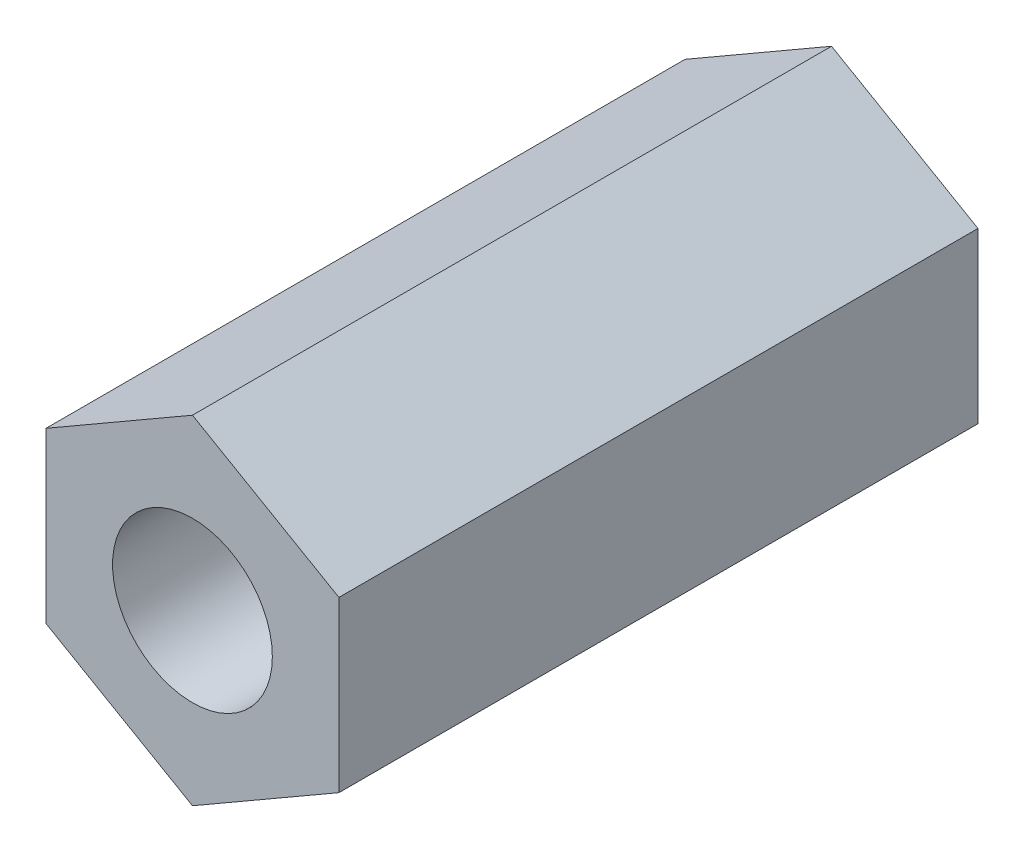
ISO-10303-21;
HEADER;
FILE_DESCRIPTION(('STEP AP214'),'2;1');
FILE_NAME('part.step','',(''),(''),'','','');
FILE_SCHEMA(('AUTOMOTIVE_DESIGN { 1 0 10303 214 1 1 1 1 }'));
ENDSEC;
DATA;
#1=APPLICATION_CONTEXT('core data for automotive mechanical design processes');
#2=APPLICATION_PROTOCOL_DEFINITION('international standard','automotive_design',2000,#1);
#3=PRODUCT_CONTEXT('',#1,'mechanical');
#4=PRODUCT('Part','Part','',(#3));
#5=PRODUCT_RELATED_PRODUCT_CATEGORY('part','',(#4));
#6=PRODUCT_DEFINITION_FORMATION('','',#4);
#7=PRODUCT_DEFINITION_CONTEXT('part definition',#1,'design');
#8=PRODUCT_DEFINITION('design','',#6,#7);
#9=PRODUCT_DEFINITION_SHAPE('','',#8);
#10=(LENGTH_UNIT() NAMED_UNIT(*) SI_UNIT(.MILLI.,.METRE.));
#11=(NAMED_UNIT(*) PLANE_ANGLE_UNIT() SI_UNIT($,.RADIAN.));
#12=(NAMED_UNIT(*) SI_UNIT($,.STERADIAN.) SOLID_ANGLE_UNIT());
#13=UNCERTAINTY_MEASURE_WITH_UNIT(LENGTH_MEASURE(1.E-05),#10,'distance_accuracy_value','');
#14=(GEOMETRIC_REPRESENTATION_CONTEXT(3) GLOBAL_UNCERTAINTY_ASSIGNED_CONTEXT((#13)) GLOBAL_UNIT_ASSIGNED_CONTEXT((#10,
#11,#12)) REPRESENTATION_CONTEXT('',''));
#15=CARTESIAN_POINT('',(0.,0.,0.));
#16=DIRECTION('',(0.,0.,1.));
#17=DIRECTION('',(1.,0.,0.));
#18=AXIS2_PLACEMENT_3D('',#15,#16,#17);
#19=CARTESIAN_POINT('',(0.,0.,6.));
#20=DIRECTION('',(0.,0.,1.));
#21=DIRECTION('',(1.,0.,0.));
#22=AXIS2_PLACEMENT_3D('',#19,#20,#21);
#23=PLANE('',#22);
#24=DIRECTION('',(0.,1.,0.));
#25=VECTOR('',#24,1.);
#26=CARTESIAN_POINT('',(2.75,-1.58771324027147,6.));
#27=LINE('',#26,#25);
#28=CARTESIAN_POINT('',(2.75,-1.58771324027147,6.));
#29=VERTEX_POINT('',#28);
#30=CARTESIAN_POINT('',(2.75,1.58771324027147,6.));
#31=VERTEX_POINT('',#30);
#32=EDGE_CURVE('E129',#29,#31,#27,.T.);
#33=ORIENTED_EDGE('',*,*,#32,.T.);
#34=DIRECTION('',(-0.866025403784439,0.5,0.));
#35=VECTOR('',#34,1.);
#36=CARTESIAN_POINT('',(2.75,1.58771324027147,6.));
#37=LINE('',#36,#35);
#38=CARTESIAN_POINT('',(0.,3.17542648054294,6.));
#39=VERTEX_POINT('',#38);
#40=EDGE_CURVE('E87',#31,#39,#37,.T.);
#41=ORIENTED_EDGE('',*,*,#40,.T.);
#42=DIRECTION('',(-0.866025403784439,-0.5,0.));
#43=VECTOR('',#42,1.);
#44=CARTESIAN_POINT('',(0.,3.17542648054294,6.));
#45=LINE('',#44,#43);
#46=CARTESIAN_POINT('',(-2.75,1.58771324027147,6.));
#47=VERTEX_POINT('',#46);
#48=EDGE_CURVE('E100',#39,#47,#45,.T.);
#49=ORIENTED_EDGE('',*,*,#48,.T.);
#50=DIRECTION('',(0.,-1.,0.));
#51=VECTOR('',#50,1.);
#52=CARTESIAN_POINT('',(-2.75,1.58771324027147,6.));
#53=LINE('',#52,#51);
#54=CARTESIAN_POINT('',(-2.75,-1.58771324027147,6.));
#55=VERTEX_POINT('',#54);
#56=EDGE_CURVE('E94',#47,#55,#53,.T.);
#57=ORIENTED_EDGE('',*,*,#56,.T.);
#58=DIRECTION('',(0.866025403784439,-0.5,0.));
#59=VECTOR('',#58,1.);
#60=CARTESIAN_POINT('',(-2.75,-1.58771324027147,6.));
#61=LINE('',#60,#59);
#62=CARTESIAN_POINT('',(0.,-3.17542648054294,6.));
#63=VERTEX_POINT('',#62);
#64=EDGE_CURVE('E98',#55,#63,#61,.T.);
#65=ORIENTED_EDGE('',*,*,#64,.T.);
#66=DIRECTION('',(0.866025403784439,0.5,0.));
#67=VECTOR('',#66,1.);
#68=CARTESIAN_POINT('',(0.,-3.17542648054294,6.));
#69=LINE('',#68,#67);
#70=EDGE_CURVE('E50',#63,#29,#69,.T.);
#71=ORIENTED_EDGE('',*,*,#70,.T.);
#72=EDGE_LOOP('',(#33,#41,#49,#57,#65,#71));
#73=FACE_BOUND('',#72,.T.);
#74=CARTESIAN_POINT('',(0.,0.,6.));
#75=DIRECTION('',(0.,0.,1.));
#76=DIRECTION('',(1.,0.,0.));
#77=AXIS2_PLACEMENT_3D('',#74,#75,#76);
#78=CIRCLE('',#77,1.5);
#79=CARTESIAN_POINT('',(1.5,0.,6.));
#80=VERTEX_POINT('',#79);
#81=EDGE_CURVE('E122',#80,#80,#78,.T.);
#82=ORIENTED_EDGE('',*,*,#81,.F.);
#83=EDGE_LOOP('',(#82));
#84=FACE_BOUND('',#83,.T.);
#85=ADVANCED_FACE('F33',(#73,#84),#23,.T.);
#86=CARTESIAN_POINT('',(0.,0.,-6.));
#87=DIRECTION('',(0.,0.,1.));
#88=DIRECTION('',(1.,0.,0.));
#89=AXIS2_PLACEMENT_3D('',#86,#87,#88);
#90=PLANE('',#89);
#91=DIRECTION('',(0.,1.,0.));
#92=VECTOR('',#91,1.);
#93=CARTESIAN_POINT('',(2.75,-1.58771324027147,-6.));
#94=LINE('',#93,#92);
#95=CARTESIAN_POINT('',(2.75,-1.58771324027147,-6.));
#96=VERTEX_POINT('',#95);
#97=CARTESIAN_POINT('',(2.75,1.58771324027147,-6.));
#98=VERTEX_POINT('',#97);
#99=EDGE_CURVE('E118',#96,#98,#94,.T.);
#100=ORIENTED_EDGE('',*,*,#99,.F.);
#101=DIRECTION('',(0.866025403784439,0.5,0.));
#102=VECTOR('',#101,1.);
#103=CARTESIAN_POINT('',(0.,-3.17542648054294,-6.));
#104=LINE('',#103,#102);
#105=CARTESIAN_POINT('',(0.,-3.17542648054294,-6.));
#106=VERTEX_POINT('',#105);
#107=EDGE_CURVE('E79',#106,#96,#104,.T.);
#108=ORIENTED_EDGE('',*,*,#107,.F.);
#109=DIRECTION('',(0.866025403784439,-0.5,0.));
#110=VECTOR('',#109,1.);
#111=CARTESIAN_POINT('',(-2.75,-1.58771324027147,-6.));
#112=LINE('',#111,#110);
#113=CARTESIAN_POINT('',(-2.75,-1.58771324027147,-6.));
#114=VERTEX_POINT('',#113);
#115=EDGE_CURVE('E73',#114,#106,#112,.T.);
#116=ORIENTED_EDGE('',*,*,#115,.F.);
#117=DIRECTION('',(0.,-1.,0.));
#118=VECTOR('',#117,1.);
#119=CARTESIAN_POINT('',(-2.75,1.58771324027147,-6.));
#120=LINE('',#119,#118);
#121=CARTESIAN_POINT('',(-2.75,1.58771324027147,-6.));
#122=VERTEX_POINT('',#121);
#123=EDGE_CURVE('E108',#122,#114,#120,.T.);
#124=ORIENTED_EDGE('',*,*,#123,.F.);
#125=DIRECTION('',(-0.866025403784439,-0.5,0.));
#126=VECTOR('',#125,1.);
#127=CARTESIAN_POINT('',(0.,3.17542648054294,-6.));
#128=LINE('',#127,#126);
#129=CARTESIAN_POINT('',(0.,3.17542648054294,-6.));
#130=VERTEX_POINT('',#129);
#131=EDGE_CURVE('E124',#130,#122,#128,.T.);
#132=ORIENTED_EDGE('',*,*,#131,.F.);
#133=DIRECTION('',(-0.866025403784439,0.5,0.));
#134=VECTOR('',#133,1.);
#135=CARTESIAN_POINT('',(2.75,1.58771324027147,-6.));
#136=LINE('',#135,#134);
#137=EDGE_CURVE('E121',#98,#130,#136,.T.);
#138=ORIENTED_EDGE('',*,*,#137,.F.);
#139=EDGE_LOOP('',(#100,#108,#116,#124,#132,#138));
#140=FACE_BOUND('',#139,.T.);
#141=CARTESIAN_POINT('',(0.,0.,-6.));
#142=DIRECTION('',(0.,0.,1.));
#143=DIRECTION('',(1.,0.,0.));
#144=AXIS2_PLACEMENT_3D('',#141,#142,#143);
#145=CIRCLE('',#144,1.5);
#146=CARTESIAN_POINT('',(1.5,0.,-6.));
#147=VERTEX_POINT('',#146);
#148=EDGE_CURVE('E222',#147,#147,#145,.T.);
#149=ORIENTED_EDGE('',*,*,#148,.T.);
#150=EDGE_LOOP('',(#149));
#151=FACE_BOUND('',#150,.T.);
#152=ADVANCED_FACE('F138',(#140,#151),#90,.F.);
#153=CARTESIAN_POINT('',(2.75,-1.58771324027147,6.));
#154=DIRECTION('',(-1.,0.,0.));
#155=DIRECTION('',(0.,-1.,0.));
#156=AXIS2_PLACEMENT_3D('',#153,#154,#155);
#157=PLANE('',#156);
#158=ORIENTED_EDGE('',*,*,#99,.T.);
#159=DIRECTION('',(0.,0.,-1.));
#160=VECTOR('',#159,1.);
#161=CARTESIAN_POINT('',(2.75,1.58771324027147,6.));
#162=LINE('',#161,#160);
#163=EDGE_CURVE('E11',#31,#98,#162,.T.);
#164=ORIENTED_EDGE('',*,*,#163,.F.);
#165=ORIENTED_EDGE('',*,*,#32,.F.);
#166=DIRECTION('',(0.,0.,-1.));
#167=VECTOR('',#166,1.);
#168=CARTESIAN_POINT('',(2.75,-1.58771324027147,6.));
#169=LINE('',#168,#167);
#170=EDGE_CURVE('E114',#29,#96,#169,.T.);
#171=ORIENTED_EDGE('',*,*,#170,.T.);
#172=EDGE_LOOP('',(#158,#164,#165,#171));
#173=FACE_BOUND('',#172,.T.);
#174=ADVANCED_FACE('F35',(#173),#157,.F.);
#175=CARTESIAN_POINT('',(2.75,1.58771324027147,6.));
#176=DIRECTION('',(-0.5,-0.866025403784439,0.));
#177=DIRECTION('',(0.866025403784439,-0.5,0.));
#178=AXIS2_PLACEMENT_3D('',#175,#176,#177);
#179=PLANE('',#178);
#180=ORIENTED_EDGE('',*,*,#137,.T.);
#181=DIRECTION('',(0.,0.,-1.));
#182=VECTOR('',#181,1.);
#183=CARTESIAN_POINT('',(0.,3.17542648054294,6.));
#184=LINE('',#183,#182);
#185=EDGE_CURVE('E42',#39,#130,#184,.T.);
#186=ORIENTED_EDGE('',*,*,#185,.F.);
#187=ORIENTED_EDGE('',*,*,#40,.F.);
#188=ORIENTED_EDGE('',*,*,#163,.T.);
#189=EDGE_LOOP('',(#180,#186,#187,#188));
#190=FACE_BOUND('',#189,.T.);
#191=ADVANCED_FACE('F163',(#190),#179,.F.);
#192=CARTESIAN_POINT('',(0.,3.17542648054294,6.));
#193=DIRECTION('',(0.5,-0.866025403784439,0.));
#194=DIRECTION('',(0.866025403784439,0.5,0.));
#195=AXIS2_PLACEMENT_3D('',#192,#193,#194);
#196=PLANE('',#195);
#197=ORIENTED_EDGE('',*,*,#131,.T.);
#198=DIRECTION('',(0.,0.,-1.));
#199=VECTOR('',#198,1.);
#200=CARTESIAN_POINT('',(-2.75,1.58771324027147,6.));
#201=LINE('',#200,#199);
#202=EDGE_CURVE('E109',#47,#122,#201,.T.);
#203=ORIENTED_EDGE('',*,*,#202,.F.);
#204=ORIENTED_EDGE('',*,*,#48,.F.);
#205=ORIENTED_EDGE('',*,*,#185,.T.);
#206=EDGE_LOOP('',(#197,#203,#204,#205));
#207=FACE_BOUND('',#206,.T.);
#208=ADVANCED_FACE('F135',(#207),#196,.F.);
#209=CARTESIAN_POINT('',(-2.75,1.58771324027147,6.));
#210=DIRECTION('',(1.,0.,0.));
#211=DIRECTION('',(0.,0.,-1.));
#212=AXIS2_PLACEMENT_3D('',#209,#210,#211);
#213=PLANE('',#212);
#214=ORIENTED_EDGE('',*,*,#123,.T.);
#215=DIRECTION('',(0.,0.,-1.));
#216=VECTOR('',#215,1.);
#217=CARTESIAN_POINT('',(-2.75,-1.58771324027147,6.));
#218=LINE('',#217,#216);
#219=EDGE_CURVE('E105',#55,#114,#218,.T.);
#220=ORIENTED_EDGE('',*,*,#219,.F.);
#221=ORIENTED_EDGE('',*,*,#56,.F.);
#222=ORIENTED_EDGE('',*,*,#202,.T.);
#223=EDGE_LOOP('',(#214,#220,#221,#222));
#224=FACE_BOUND('',#223,.T.);
#225=ADVANCED_FACE('F106',(#224),#213,.F.);
#226=CARTESIAN_POINT('',(-2.75,-1.58771324027147,6.));
#227=DIRECTION('',(0.5,0.866025403784439,0.));
#228=DIRECTION('',(-0.866025403784439,0.5,0.));
#229=AXIS2_PLACEMENT_3D('',#226,#227,#228);
#230=PLANE('',#229);
#231=ORIENTED_EDGE('',*,*,#115,.T.);
#232=DIRECTION('',(0.,0.,-1.));
#233=VECTOR('',#232,1.);
#234=CARTESIAN_POINT('',(0.,-3.17542648054294,6.));
#235=LINE('',#234,#233);
#236=EDGE_CURVE('E110',#63,#106,#235,.T.);
#237=ORIENTED_EDGE('',*,*,#236,.F.);
#238=ORIENTED_EDGE('',*,*,#64,.F.);
#239=ORIENTED_EDGE('',*,*,#219,.T.);
#240=EDGE_LOOP('',(#231,#237,#238,#239));
#241=FACE_BOUND('',#240,.T.);
#242=ADVANCED_FACE('F112',(#241),#230,.F.);
#243=CARTESIAN_POINT('',(0.,-3.17542648054294,6.));
#244=DIRECTION('',(-0.5,0.866025403784439,0.));
#245=DIRECTION('',(-0.866025403784439,-0.5,0.));
#246=AXIS2_PLACEMENT_3D('',#243,#244,#245);
#247=PLANE('',#246);
#248=ORIENTED_EDGE('',*,*,#107,.T.);
#249=ORIENTED_EDGE('',*,*,#170,.F.);
#250=ORIENTED_EDGE('',*,*,#70,.F.);
#251=ORIENTED_EDGE('',*,*,#236,.T.);
#252=EDGE_LOOP('',(#248,#249,#250,#251));
#253=FACE_BOUND('',#252,.T.);
#254=ADVANCED_FACE('F143',(#253),#247,.F.);
#255=CARTESIAN_POINT('',(0.,0.,6.));
#256=DIRECTION('',(0.,0.,-1.));
#257=DIRECTION('',(-1.,0.,0.));
#258=AXIS2_PLACEMENT_3D('',#255,#256,#257);
#259=CYLINDRICAL_SURFACE('',#258,1.5);
#260=ORIENTED_EDGE('',*,*,#81,.T.);
#261=EDGE_LOOP('',(#260));
#262=FACE_BOUND('',#261,.T.);
#263=ORIENTED_EDGE('',*,*,#148,.F.);
#264=EDGE_LOOP('',(#263));
#265=FACE_BOUND('',#264,.T.);
#266=ADVANCED_FACE('F145',(#262,#265),#259,.F.);
#267=CLOSED_SHELL('',(#85,#152,#174,#191,#208,#225,#242,#254,#266));
#268=MANIFOLD_SOLID_BREP('B2',#267);
#269=ADVANCED_BREP_SHAPE_REPRESENTATION('',(#18,#268),#14);
#270=SHAPE_DEFINITION_REPRESENTATION(#9,#269);
ENDSEC;
END-ISO-10303-21;
